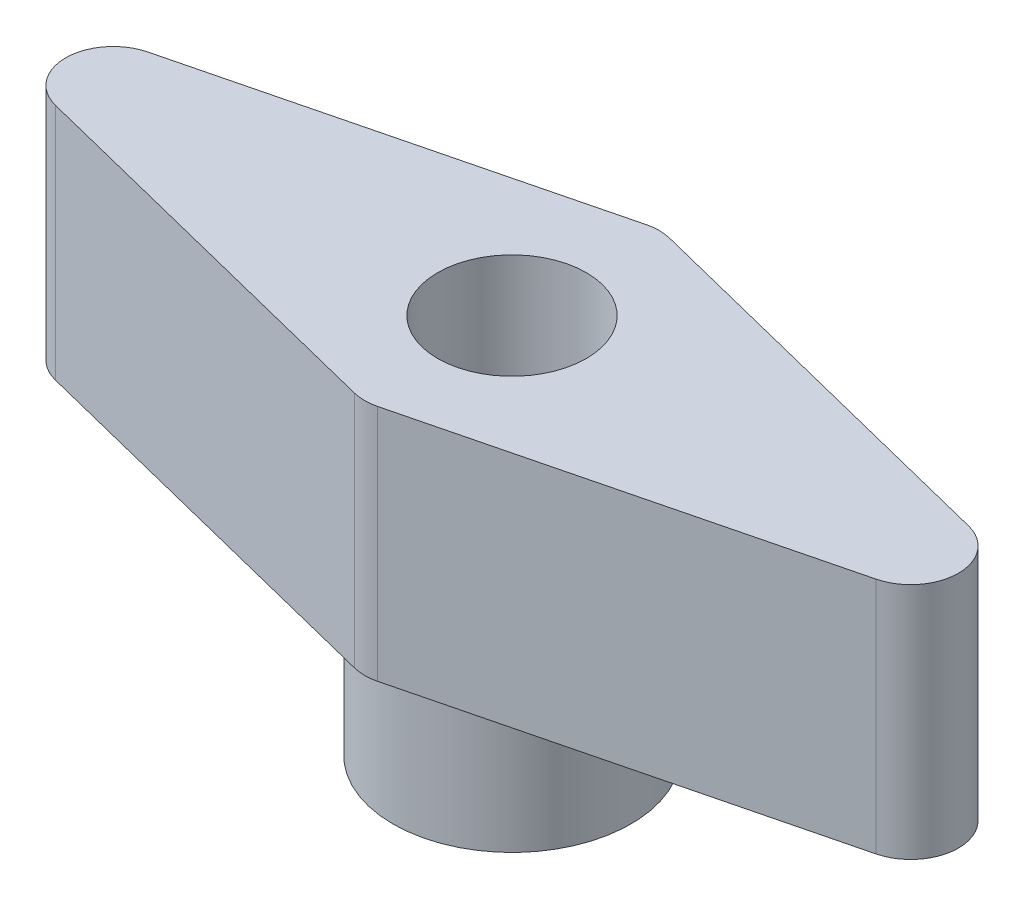
ISO-10303-21;
HEADER;
FILE_DESCRIPTION(('STEP AP214'),'2;1');
FILE_NAME('part.step','',(''),(''),'','','');
FILE_SCHEMA(('AUTOMOTIVE_DESIGN { 1 0 10303 214 1 1 1 1 }'));
ENDSEC;
DATA;
#1=APPLICATION_CONTEXT('core data for automotive mechanical design processes');
#2=APPLICATION_PROTOCOL_DEFINITION('international standard','automotive_design',2000,#1);
#3=PRODUCT_CONTEXT('',#1,'mechanical');
#4=PRODUCT('Part','Part','',(#3));
#5=PRODUCT_RELATED_PRODUCT_CATEGORY('part','',(#4));
#6=PRODUCT_DEFINITION_FORMATION('','',#4);
#7=PRODUCT_DEFINITION_CONTEXT('part definition',#1,'design');
#8=PRODUCT_DEFINITION('design','',#6,#7);
#9=PRODUCT_DEFINITION_SHAPE('','',#8);
#10=(LENGTH_UNIT() NAMED_UNIT(*) SI_UNIT(.MILLI.,.METRE.));
#11=(NAMED_UNIT(*) PLANE_ANGLE_UNIT() SI_UNIT($,.RADIAN.));
#12=(NAMED_UNIT(*) SI_UNIT($,.STERADIAN.) SOLID_ANGLE_UNIT());
#13=UNCERTAINTY_MEASURE_WITH_UNIT(LENGTH_MEASURE(1.E-05),#10,'distance_accuracy_value','');
#14=(GEOMETRIC_REPRESENTATION_CONTEXT(3) GLOBAL_UNCERTAINTY_ASSIGNED_CONTEXT((#13)) GLOBAL_UNIT_ASSIGNED_CONTEXT((#10,
#11,#12)) REPRESENTATION_CONTEXT('',''));
#15=CARTESIAN_POINT('',(0.,0.,0.));
#16=DIRECTION('',(0.,0.,1.));
#17=DIRECTION('',(1.,0.,0.));
#18=AXIS2_PLACEMENT_3D('',#15,#16,#17);
#19=CARTESIAN_POINT('',(21.2773117109311,-2.54,0.));
#20=DIRECTION('',(0.,1.,0.));
#21=DIRECTION('',(0.,0.,1.));
#22=AXIS2_PLACEMENT_3D('',#19,#20,#21);
#23=PLANE('',#22);
#24=DIRECTION('',(0.970142500145332,0.,-0.242535625036333));
#25=VECTOR('',#24,1.);
#26=CARTESIAN_POINT('',(21.2773117109311,-2.54,0.));
#27=LINE('',#26,#25);
#28=CARTESIAN_POINT('',(4.84135364991331,-2.54,4.10898951525446));
#29=VERTEX_POINT('',#28);
#30=CARTESIAN_POINT('',(19.3059821506358,-2.54,0.49283239007383));
#31=VERTEX_POINT('',#30);
#32=EDGE_CURVE('E167',#29,#31,#27,.T.);
#33=ORIENTED_EDGE('',*,*,#32,.F.);
#34=CARTESIAN_POINT('',(0.,-2.54,0.));
#35=DIRECTION('',(0.,1.,0.));
#36=DIRECTION('',(0.,0.,1.));
#37=AXIS2_PLACEMENT_3D('',#34,#35,#36);
#38=CIRCLE('',#37,6.35);
#39=CARTESIAN_POINT('',(4.84135364991331,-2.54,-4.10898951525446));
#40=VERTEX_POINT('',#39);
#41=EDGE_CURVE('E11',#29,#40,#38,.T.);
#42=ORIENTED_EDGE('',*,*,#41,.T.);
#43=DIRECTION('',(-0.970142500145332,0.,-0.242535625036333));
#44=VECTOR('',#43,1.);
#45=CARTESIAN_POINT('',(21.2773117109311,-2.54,0.));
#46=LINE('',#45,#44);
#47=CARTESIAN_POINT('',(19.3059821506358,-2.54,-0.492832390073826));
#48=VERTEX_POINT('',#47);
#49=EDGE_CURVE('E165',#48,#40,#46,.T.);
#50=ORIENTED_EDGE('',*,*,#49,.F.);
#51=CARTESIAN_POINT('',(19.1827740531174,-2.54,0.));
#52=DIRECTION('',(0.,1.,0.));
#53=DIRECTION('',(0.,0.,1.));
#54=AXIS2_PLACEMENT_3D('',#51,#52,#53);
#55=CIRCLE('',#54,0.508);
#56=EDGE_CURVE('E250',#48,#31,#55,.F.);
#57=ORIENTED_EDGE('',*,*,#56,.T.);
#58=EDGE_LOOP('',(#33,#42,#50,#57));
#59=FACE_BOUND('',#58,.T.);
#60=ADVANCED_FACE('F33',(#59),#23,.F.);
#61=CARTESIAN_POINT('',(21.2773117109311,-12.7,0.));
#62=DIRECTION('',(0.,1.,0.));
#63=DIRECTION('',(0.,0.,1.));
#64=AXIS2_PLACEMENT_3D('',#61,#62,#63);
#65=CYLINDRICAL_SURFACE('',#64,2.54);
#66=CARTESIAN_POINT('',(21.2773117109311,0.,0.));
#67=DIRECTION('',(0.,1.,0.));
#68=DIRECTION('',(0.,0.,1.));
#69=AXIS2_PLACEMENT_3D('',#66,#67,#68);
#70=CIRCLE('',#69,2.54);
#71=CARTESIAN_POINT('',(21.8933521985234,0.,2.46416195036915));
#72=VERTEX_POINT('',#71);
#73=CARTESIAN_POINT('',(21.8933521985234,0.,-2.46416195036914));
#74=VERTEX_POINT('',#73);
#75=EDGE_CURVE('E176',#72,#74,#70,.T.);
#76=ORIENTED_EDGE('',*,*,#75,.F.);
#77=DIRECTION('',(0.,1.,0.));
#78=VECTOR('',#77,1.);
#79=CARTESIAN_POINT('',(21.8933521985234,-12.7,2.46416195036915));
#80=LINE('',#79,#78);
#81=CARTESIAN_POINT('',(21.8933521985234,-12.7,2.46416195036915));
#82=VERTEX_POINT('',#81);
#83=EDGE_CURVE('E231',#82,#72,#80,.T.);
#84=ORIENTED_EDGE('',*,*,#83,.F.);
#85=CARTESIAN_POINT('',(21.2773117109311,-12.7,0.));
#86=DIRECTION('',(0.,1.,0.));
#87=DIRECTION('',(0.,0.,1.));
#88=AXIS2_PLACEMENT_3D('',#85,#86,#87);
#89=CIRCLE('',#88,2.54);
#90=CARTESIAN_POINT('',(21.8933521985234,-12.7,-2.46416195036914));
#91=VERTEX_POINT('',#90);
#92=EDGE_CURVE('E183',#82,#91,#89,.T.);
#93=ORIENTED_EDGE('',*,*,#92,.T.);
#94=DIRECTION('',(0.,1.,0.));
#95=VECTOR('',#94,1.);
#96=CARTESIAN_POINT('',(21.8933521985234,-12.7,-2.46416195036914));
#97=LINE('',#96,#95);
#98=EDGE_CURVE('E208',#91,#74,#97,.T.);
#99=ORIENTED_EDGE('',*,*,#98,.T.);
#100=EDGE_LOOP('',(#76,#84,#93,#99));
#101=FACE_BOUND('',#100,.T.);
#102=ADVANCED_FACE('F316',(#101),#65,.T.);
#103=CARTESIAN_POINT('',(0.616040487592289,-12.7,7.78348987810193));
#104=DIRECTION('',(0.242535625036333,0.,0.970142500145332));
#105=DIRECTION('',(0.970142500145332,0.,-0.242535625036333));
#106=AXIS2_PLACEMENT_3D('',#103,#104,#105);
#107=PLANE('',#106);
#108=DIRECTION('',(0.970142500145332,0.,-0.242535625036333));
#109=VECTOR('',#108,1.);
#110=CARTESIAN_POINT('',(0.616040487592289,0.,7.78348987810193));
#111=LINE('',#110,#109);
#112=CARTESIAN_POINT('',(0.616040487592289,0.,7.78348987810193));
#113=VERTEX_POINT('',#112);
#114=EDGE_CURVE('E187',#113,#72,#111,.T.);
#115=ORIENTED_EDGE('',*,*,#114,.F.);
#116=DIRECTION('',(0.,1.,0.));
#117=VECTOR('',#116,1.);
#118=CARTESIAN_POINT('',(0.616040487592289,-12.7,7.78348987810193));
#119=LINE('',#118,#117);
#120=CARTESIAN_POINT('',(0.616040487592289,-12.7,7.78348987810193));
#121=VERTEX_POINT('',#120);
#122=EDGE_CURVE('E234',#121,#113,#119,.T.);
#123=ORIENTED_EDGE('',*,*,#122,.F.);
#124=DIRECTION('',(0.970142500145332,0.,-0.242535625036333));
#125=VECTOR('',#124,1.);
#126=CARTESIAN_POINT('',(0.616040487592289,-12.7,7.78348987810193));
#127=LINE('',#126,#125);
#128=EDGE_CURVE('E205',#121,#82,#127,.T.);
#129=ORIENTED_EDGE('',*,*,#128,.T.);
#130=ORIENTED_EDGE('',*,*,#83,.T.);
#131=EDGE_LOOP('',(#115,#123,#129,#130));
#132=FACE_BOUND('',#131,.T.);
#133=ADVANCED_FACE('F321',(#132),#107,.T.);
#134=CARTESIAN_POINT('',(0.,-12.7,5.31932792773278));
#135=DIRECTION('',(0.,1.,0.));
#136=DIRECTION('',(0.,0.,1.));
#137=AXIS2_PLACEMENT_3D('',#134,#135,#136);
#138=CYLINDRICAL_SURFACE('',#137,2.54);
#139=CARTESIAN_POINT('',(0.,0.,5.31932792773278));
#140=DIRECTION('',(0.,1.,0.));
#141=DIRECTION('',(0.,0.,1.));
#142=AXIS2_PLACEMENT_3D('',#139,#140,#141);
#143=CIRCLE('',#142,2.54);
#144=CARTESIAN_POINT('',(-0.616040487592282,0.,7.78348987810193));
#145=VERTEX_POINT('',#144);
#146=EDGE_CURVE('E226',#145,#113,#143,.T.);
#147=ORIENTED_EDGE('',*,*,#146,.F.);
#148=DIRECTION('',(0.,1.,0.));
#149=VECTOR('',#148,1.);
#150=CARTESIAN_POINT('',(-0.616040487592282,-12.7,7.78348987810193));
#151=LINE('',#150,#149);
#152=CARTESIAN_POINT('',(-0.616040487592282,-12.7,7.78348987810193));
#153=VERTEX_POINT('',#152);
#154=EDGE_CURVE('E236',#153,#145,#151,.T.);
#155=ORIENTED_EDGE('',*,*,#154,.F.);
#156=CARTESIAN_POINT('',(0.,-12.7,5.31932792773278));
#157=DIRECTION('',(0.,1.,0.));
#158=DIRECTION('',(0.,0.,1.));
#159=AXIS2_PLACEMENT_3D('',#156,#157,#158);
#160=CIRCLE('',#159,2.54);
#161=EDGE_CURVE('E202',#153,#121,#160,.T.);
#162=ORIENTED_EDGE('',*,*,#161,.T.);
#163=ORIENTED_EDGE('',*,*,#122,.T.);
#164=EDGE_LOOP('',(#147,#155,#162,#163));
#165=FACE_BOUND('',#164,.T.);
#166=ADVANCED_FACE('F352',(#165),#138,.T.);
#167=CARTESIAN_POINT('',(-21.8933521985234,-12.7,2.46416195036914));
#168=DIRECTION('',(-0.242535625036333,0.,0.970142500145332));
#169=DIRECTION('',(0.970142500145332,0.,0.242535625036333));
#170=AXIS2_PLACEMENT_3D('',#167,#168,#169);
#171=PLANE('',#170);
#172=DIRECTION('',(0.970142500145332,0.,0.242535625036333));
#173=VECTOR('',#172,1.);
#174=CARTESIAN_POINT('',(-21.8933521985234,0.,2.46416195036914));
#175=LINE('',#174,#173);
#176=CARTESIAN_POINT('',(-21.8933521985234,0.,2.46416195036914));
#177=VERTEX_POINT('',#176);
#178=EDGE_CURVE('E223',#177,#145,#175,.T.);
#179=ORIENTED_EDGE('',*,*,#178,.F.);
#180=DIRECTION('',(0.,1.,0.));
#181=VECTOR('',#180,1.);
#182=CARTESIAN_POINT('',(-21.8933521985234,-12.7,2.46416195036914));
#183=LINE('',#182,#181);
#184=CARTESIAN_POINT('',(-21.8933521985234,-12.7,2.46416195036914));
#185=VERTEX_POINT('',#184);
#186=EDGE_CURVE('E238',#185,#177,#183,.T.);
#187=ORIENTED_EDGE('',*,*,#186,.F.);
#188=DIRECTION('',(0.970142500145332,0.,0.242535625036333));
#189=VECTOR('',#188,1.);
#190=CARTESIAN_POINT('',(-21.8933521985234,-12.7,2.46416195036914));
#191=LINE('',#190,#189);
#192=EDGE_CURVE('E199',#185,#153,#191,.T.);
#193=ORIENTED_EDGE('',*,*,#192,.T.);
#194=ORIENTED_EDGE('',*,*,#154,.T.);
#195=EDGE_LOOP('',(#179,#187,#193,#194));
#196=FACE_BOUND('',#195,.T.);
#197=ADVANCED_FACE('F356',(#196),#171,.T.);
#198=CARTESIAN_POINT('',(-21.2773117109311,-12.7,0.));
#199=DIRECTION('',(0.,1.,0.));
#200=DIRECTION('',(0.,0.,1.));
#201=AXIS2_PLACEMENT_3D('',#198,#199,#200);
#202=CYLINDRICAL_SURFACE('',#201,2.54);
#203=CARTESIAN_POINT('',(-21.2773117109311,0.,0.));
#204=DIRECTION('',(0.,1.,0.));
#205=DIRECTION('',(0.,0.,1.));
#206=AXIS2_PLACEMENT_3D('',#203,#204,#205);
#207=CIRCLE('',#206,2.54);
#208=CARTESIAN_POINT('',(-21.8933521985234,0.,-2.46416195036914));
#209=VERTEX_POINT('',#208);
#210=EDGE_CURVE('E220',#209,#177,#207,.T.);
#211=ORIENTED_EDGE('',*,*,#210,.F.);
#212=DIRECTION('',(0.,1.,0.));
#213=VECTOR('',#212,1.);
#214=CARTESIAN_POINT('',(-21.8933521985234,-12.7,-2.46416195036914));
#215=LINE('',#214,#213);
#216=CARTESIAN_POINT('',(-21.8933521985234,-12.7,-2.46416195036914));
#217=VERTEX_POINT('',#216);
#218=EDGE_CURVE('E240',#217,#209,#215,.T.);
#219=ORIENTED_EDGE('',*,*,#218,.F.);
#220=CARTESIAN_POINT('',(-21.2773117109311,-12.7,0.));
#221=DIRECTION('',(0.,1.,0.));
#222=DIRECTION('',(0.,0.,1.));
#223=AXIS2_PLACEMENT_3D('',#220,#221,#222);
#224=CIRCLE('',#223,2.54);
#225=EDGE_CURVE('E196',#217,#185,#224,.T.);
#226=ORIENTED_EDGE('',*,*,#225,.T.);
#227=ORIENTED_EDGE('',*,*,#186,.T.);
#228=EDGE_LOOP('',(#211,#219,#226,#227));
#229=FACE_BOUND('',#228,.T.);
#230=ADVANCED_FACE('F360',(#229),#202,.T.);
#231=CARTESIAN_POINT('',(-21.8933521985234,-12.7,-2.46416195036914));
#232=DIRECTION('',(-0.242535625036333,0.,-0.970142500145332));
#233=DIRECTION('',(-0.970142500145332,0.,0.242535625036333));
#234=AXIS2_PLACEMENT_3D('',#231,#232,#233);
#235=PLANE('',#234);
#236=DIRECTION('',(-0.970142500145332,0.,0.242535625036333));
#237=VECTOR('',#236,1.);
#238=CARTESIAN_POINT('',(-21.8933521985234,0.,-2.46416195036914));
#239=LINE('',#238,#237);
#240=CARTESIAN_POINT('',(-0.616040487592288,0.,-7.78348987810193));
#241=VERTEX_POINT('',#240);
#242=EDGE_CURVE('E217',#241,#209,#239,.T.);
#243=ORIENTED_EDGE('',*,*,#242,.F.);
#244=DIRECTION('',(0.,1.,0.));
#245=VECTOR('',#244,1.);
#246=CARTESIAN_POINT('',(-0.616040487592288,-12.7,-7.78348987810193));
#247=LINE('',#246,#245);
#248=CARTESIAN_POINT('',(-0.616040487592288,-12.7,-7.78348987810193));
#249=VERTEX_POINT('',#248);
#250=EDGE_CURVE('E242',#249,#241,#247,.T.);
#251=ORIENTED_EDGE('',*,*,#250,.F.);
#252=DIRECTION('',(-0.970142500145332,0.,0.242535625036333));
#253=VECTOR('',#252,1.);
#254=CARTESIAN_POINT('',(-21.8933521985234,-12.7,-2.46416195036914));
#255=LINE('',#254,#253);
#256=EDGE_CURVE('E193',#249,#217,#255,.T.);
#257=ORIENTED_EDGE('',*,*,#256,.T.);
#258=ORIENTED_EDGE('',*,*,#218,.T.);
#259=EDGE_LOOP('',(#243,#251,#257,#258));
#260=FACE_BOUND('',#259,.T.);
#261=ADVANCED_FACE('F364',(#260),#235,.T.);
#262=CARTESIAN_POINT('',(0.,-12.7,-5.31932792773278));
#263=DIRECTION('',(0.,1.,0.));
#264=DIRECTION('',(0.,0.,1.));
#265=AXIS2_PLACEMENT_3D('',#262,#263,#264);
#266=CYLINDRICAL_SURFACE('',#265,2.54);
#267=CARTESIAN_POINT('',(0.,0.,-5.31932792773278));
#268=DIRECTION('',(0.,1.,0.));
#269=DIRECTION('',(0.,0.,-1.));
#270=AXIS2_PLACEMENT_3D('',#267,#268,#269);
#271=CIRCLE('',#270,2.54);
#272=CARTESIAN_POINT('',(0.616040487592284,0.,-7.78348987810193));
#273=VERTEX_POINT('',#272);
#274=EDGE_CURVE('E214',#273,#241,#271,.T.);
#275=ORIENTED_EDGE('',*,*,#274,.F.);
#276=DIRECTION('',(0.,1.,0.));
#277=VECTOR('',#276,1.);
#278=CARTESIAN_POINT('',(0.616040487592284,-12.7,-7.78348987810193));
#279=LINE('',#278,#277);
#280=CARTESIAN_POINT('',(0.616040487592284,-12.7,-7.78348987810193));
#281=VERTEX_POINT('',#280);
#282=EDGE_CURVE('E244',#281,#273,#279,.T.);
#283=ORIENTED_EDGE('',*,*,#282,.F.);
#284=CARTESIAN_POINT('',(0.,-12.7,-5.31932792773278));
#285=DIRECTION('',(0.,1.,0.));
#286=DIRECTION('',(0.,0.,-1.));
#287=AXIS2_PLACEMENT_3D('',#284,#285,#286);
#288=CIRCLE('',#287,2.54);
#289=EDGE_CURVE('E190',#281,#249,#288,.T.);
#290=ORIENTED_EDGE('',*,*,#289,.T.);
#291=ORIENTED_EDGE('',*,*,#250,.T.);
#292=EDGE_LOOP('',(#275,#283,#290,#291));
#293=FACE_BOUND('',#292,.T.);
#294=ADVANCED_FACE('F368',(#293),#266,.T.);
#295=CARTESIAN_POINT('',(0.616040487592283,-12.7,-7.78348987810193));
#296=DIRECTION('',(0.242535625036333,0.,-0.970142500145332));
#297=DIRECTION('',(-0.970142500145332,0.,-0.242535625036333));
#298=AXIS2_PLACEMENT_3D('',#295,#296,#297);
#299=PLANE('',#298);
#300=DIRECTION('',(-0.970142500145332,0.,-0.242535625036333));
#301=VECTOR('',#300,1.);
#302=CARTESIAN_POINT('',(0.616040487592283,0.,-7.78348987810193));
#303=LINE('',#302,#301);
#304=EDGE_CURVE('E211',#74,#273,#303,.T.);
#305=ORIENTED_EDGE('',*,*,#304,.F.);
#306=ORIENTED_EDGE('',*,*,#98,.F.);
#307=DIRECTION('',(-0.970142500145332,0.,-0.242535625036333));
#308=VECTOR('',#307,1.);
#309=CARTESIAN_POINT('',(0.616040487592283,-12.7,-7.78348987810193));
#310=LINE('',#309,#308);
#311=EDGE_CURVE('E186',#91,#281,#310,.T.);
#312=ORIENTED_EDGE('',*,*,#311,.T.);
#313=ORIENTED_EDGE('',*,*,#282,.T.);
#314=EDGE_LOOP('',(#305,#306,#312,#313));
#315=FACE_BOUND('',#314,.T.);
#316=ADVANCED_FACE('F348',(#315),#299,.T.);
#317=CARTESIAN_POINT('',(21.2773117109311,-12.7,0.));
#318=DIRECTION('',(0.,1.,0.));
#319=DIRECTION('',(0.,0.,1.));
#320=AXIS2_PLACEMENT_3D('',#317,#318,#319);
#321=PLANE('',#320);
#322=DIRECTION('',(-0.970142500145332,0.,-0.242535625036333));
#323=VECTOR('',#322,1.);
#324=CARTESIAN_POINT('',(21.2773117109311,-12.7,0.));
#325=LINE('',#324,#323);
#326=CARTESIAN_POINT('',(19.3059821506358,-12.7,-0.492832390073826));
#327=VERTEX_POINT('',#326);
#328=CARTESIAN_POINT('',(4.84135364991331,-12.7,-4.10898951525446));
#329=VERTEX_POINT('',#328);
#330=EDGE_CURVE('E180',#327,#329,#325,.T.);
#331=ORIENTED_EDGE('',*,*,#330,.T.);
#332=CARTESIAN_POINT('',(0.,-12.7,0.));
#333=DIRECTION('',(0.,1.,0.));
#334=DIRECTION('',(0.,0.,1.));
#335=AXIS2_PLACEMENT_3D('',#332,#333,#334);
#336=CIRCLE('',#335,6.35);
#337=CARTESIAN_POINT('',(-4.84135364991331,-12.7,-4.10898951525446));
#338=VERTEX_POINT('',#337);
#339=EDGE_CURVE('E283',#329,#338,#336,.T.);
#340=ORIENTED_EDGE('',*,*,#339,.T.);
#341=DIRECTION('',(-0.970142500145332,0.,0.242535625036333));
#342=VECTOR('',#341,1.);
#343=CARTESIAN_POINT('',(18.7740985684686,-12.7,-10.0128525698499));
#344=LINE('',#343,#342);
#345=CARTESIAN_POINT('',(-19.3059821506358,-12.7,-0.492832390073826));
#346=VERTEX_POINT('',#345);
#347=EDGE_CURVE('E158',#338,#346,#344,.T.);
#348=ORIENTED_EDGE('',*,*,#347,.T.);
#349=CARTESIAN_POINT('',(-19.1827740531174,-12.7,0.));
#350=DIRECTION('',(0.,1.,0.));
#351=DIRECTION('',(0.,0.,1.));
#352=AXIS2_PLACEMENT_3D('',#349,#350,#351);
#353=CIRCLE('',#352,0.508);
#354=CARTESIAN_POINT('',(-19.3059821506358,-12.7,0.492832390073823));
#355=VERTEX_POINT('',#354);
#356=EDGE_CURVE('E56',#346,#355,#353,.T.);
#357=ORIENTED_EDGE('',*,*,#356,.T.);
#358=DIRECTION('',(0.970142500145332,0.,0.242535625036333));
#359=VECTOR('',#358,1.);
#360=CARTESIAN_POINT('',(18.7740985684687,-12.7,10.0128525698499));
#361=LINE('',#360,#359);
#362=CARTESIAN_POINT('',(-4.84135364991331,-12.7,4.10898951525446));
#363=VERTEX_POINT('',#362);
#364=EDGE_CURVE('E177',#355,#363,#361,.T.);
#365=ORIENTED_EDGE('',*,*,#364,.T.);
#366=CARTESIAN_POINT('',(4.84135364991331,-12.7,4.10898951525446));
#367=VERTEX_POINT('',#366);
#368=EDGE_CURVE('E286',#363,#367,#336,.T.);
#369=ORIENTED_EDGE('',*,*,#368,.T.);
#370=DIRECTION('',(0.970142500145332,0.,-0.242535625036333));
#371=VECTOR('',#370,1.);
#372=CARTESIAN_POINT('',(21.2773117109311,-12.7,0.));
#373=LINE('',#372,#371);
#374=CARTESIAN_POINT('',(19.3059821506358,-12.7,0.49283239007383));
#375=VERTEX_POINT('',#374);
#376=EDGE_CURVE('E174',#367,#375,#373,.T.);
#377=ORIENTED_EDGE('',*,*,#376,.T.);
#378=CARTESIAN_POINT('',(19.1827740531174,-12.7,0.));
#379=DIRECTION('',(0.,1.,0.));
#380=DIRECTION('',(0.,0.,1.));
#381=AXIS2_PLACEMENT_3D('',#378,#379,#380);
#382=CIRCLE('',#381,0.508);
#383=EDGE_CURVE('E261',#375,#327,#382,.T.);
#384=ORIENTED_EDGE('',*,*,#383,.T.);
#385=EDGE_LOOP('',(#331,#340,#348,#357,#365,#369,#377,#384));
#386=FACE_BOUND('',#385,.T.);
#387=ORIENTED_EDGE('',*,*,#92,.F.);
#388=ORIENTED_EDGE('',*,*,#128,.F.);
#389=ORIENTED_EDGE('',*,*,#161,.F.);
#390=ORIENTED_EDGE('',*,*,#192,.F.);
#391=ORIENTED_EDGE('',*,*,#225,.F.);
#392=ORIENTED_EDGE('',*,*,#256,.F.);
#393=ORIENTED_EDGE('',*,*,#289,.F.);
#394=ORIENTED_EDGE('',*,*,#311,.F.);
#395=EDGE_LOOP('',(#387,#388,#389,#390,#391,#392,#393,#394));
#396=FACE_BOUND('',#395,.T.);
#397=ADVANCED_FACE('F264',(#386,#396),#321,.F.);
#398=CARTESIAN_POINT('',(21.2773117109311,0.,0.));
#399=DIRECTION('',(0.,1.,0.));
#400=DIRECTION('',(0.,0.,1.));
#401=AXIS2_PLACEMENT_3D('',#398,#399,#400);
#402=PLANE('',#401);
#403=CARTESIAN_POINT('',(0.,0.,0.));
#404=DIRECTION('',(0.,-1.,0.));
#405=DIRECTION('',(0.,0.,-1.));
#406=AXIS2_PLACEMENT_3D('',#403,#404,#405);
#407=CIRCLE('',#406,3.96875);
#408=CARTESIAN_POINT('',(0.,0.,-3.96875));
#409=VERTEX_POINT('',#408);
#410=EDGE_CURVE('E294',#409,#409,#407,.T.);
#411=ORIENTED_EDGE('',*,*,#410,.T.);
#412=EDGE_LOOP('',(#411));
#413=FACE_BOUND('',#412,.T.);
#414=ORIENTED_EDGE('',*,*,#75,.T.);
#415=ORIENTED_EDGE('',*,*,#304,.T.);
#416=ORIENTED_EDGE('',*,*,#274,.T.);
#417=ORIENTED_EDGE('',*,*,#242,.T.);
#418=ORIENTED_EDGE('',*,*,#210,.T.);
#419=ORIENTED_EDGE('',*,*,#178,.T.);
#420=ORIENTED_EDGE('',*,*,#146,.T.);
#421=ORIENTED_EDGE('',*,*,#114,.T.);
#422=EDGE_LOOP('',(#414,#415,#416,#417,#418,#419,#420,#421));
#423=FACE_BOUND('',#422,.T.);
#424=ADVANCED_FACE('F298',(#413,#423),#402,.T.);
#425=CARTESIAN_POINT('',(0.,-12.7,5.31932792773278));
#426=DIRECTION('',(0.242535625036333,0.,0.970142500145332));
#427=DIRECTION('',(0.970142500145332,0.,-0.242535625036333));
#428=AXIS2_PLACEMENT_3D('',#425,#426,#427);
#429=PLANE('',#428);
#430=ORIENTED_EDGE('',*,*,#376,.F.);
#431=DIRECTION('',(0.,1.,0.));
#432=VECTOR('',#431,1.);
#433=CARTESIAN_POINT('',(4.84135364991331,-20.32,4.10898951525446));
#434=LINE('',#433,#432);
#435=EDGE_CURVE('E170',#367,#29,#434,.T.);
#436=ORIENTED_EDGE('',*,*,#435,.T.);
#437=ORIENTED_EDGE('',*,*,#32,.T.);
#438=DIRECTION('',(0.,1.,0.));
#439=VECTOR('',#438,1.);
#440=CARTESIAN_POINT('',(19.3059821506358,-12.7,0.49283239007383));
#441=LINE('',#440,#439);
#442=EDGE_CURVE('E253',#31,#375,#441,.F.);
#443=ORIENTED_EDGE('',*,*,#442,.T.);
#444=EDGE_LOOP('',(#430,#436,#437,#443));
#445=FACE_BOUND('',#444,.T.);
#446=ADVANCED_FACE('F281',(#445),#429,.F.);
#447=CARTESIAN_POINT('',(-21.2773117109311,-12.7,0.));
#448=DIRECTION('',(-0.242535625036333,0.,0.970142500145332));
#449=DIRECTION('',(0.970142500145332,0.,0.242535625036333));
#450=AXIS2_PLACEMENT_3D('',#447,#448,#449);
#451=PLANE('',#450);
#452=DIRECTION('',(0.970142500145332,0.,0.242535625036333));
#453=VECTOR('',#452,1.);
#454=CARTESIAN_POINT('',(18.7740985684687,-2.54,10.0128525698499));
#455=LINE('',#454,#453);
#456=CARTESIAN_POINT('',(-19.3059821506358,-2.54,0.492832390073823));
#457=VERTEX_POINT('',#456);
#458=CARTESIAN_POINT('',(-4.84135364991331,-2.54,4.10898951525446));
#459=VERTEX_POINT('',#458);
#460=EDGE_CURVE('E164',#457,#459,#455,.T.);
#461=ORIENTED_EDGE('',*,*,#460,.T.);
#462=DIRECTION('',(0.,1.,0.));
#463=VECTOR('',#462,1.);
#464=CARTESIAN_POINT('',(-4.84135364991331,-20.32,4.10898951525446));
#465=LINE('',#464,#463);
#466=EDGE_CURVE('E48',#459,#363,#465,.F.);
#467=ORIENTED_EDGE('',*,*,#466,.T.);
#468=ORIENTED_EDGE('',*,*,#364,.F.);
#469=DIRECTION('',(0.,1.,0.));
#470=VECTOR('',#469,1.);
#471=CARTESIAN_POINT('',(-19.3059821506358,-2.54,0.492832390073829));
#472=LINE('',#471,#470);
#473=EDGE_CURVE('E258',#355,#457,#472,.T.);
#474=ORIENTED_EDGE('',*,*,#473,.T.);
#475=EDGE_LOOP('',(#461,#467,#468,#474));
#476=FACE_BOUND('',#475,.T.);
#477=ADVANCED_FACE('F334',(#476),#451,.F.);
#478=CARTESIAN_POINT('',(-21.2773117109311,-12.7,0.));
#479=DIRECTION('',(-0.242535625036333,0.,-0.970142500145332));
#480=DIRECTION('',(-0.970142500145332,0.,0.242535625036333));
#481=AXIS2_PLACEMENT_3D('',#478,#479,#480);
#482=PLANE('',#481);
#483=ORIENTED_EDGE('',*,*,#347,.F.);
#484=DIRECTION('',(0.,1.,0.));
#485=VECTOR('',#484,1.);
#486=CARTESIAN_POINT('',(-4.84135364991331,-20.32,-4.10898951525446));
#487=LINE('',#486,#485);
#488=CARTESIAN_POINT('',(-4.84135364991331,-2.54,-4.10898951525446));
#489=VERTEX_POINT('',#488);
#490=EDGE_CURVE('E146',#338,#489,#487,.T.);
#491=ORIENTED_EDGE('',*,*,#490,.T.);
#492=DIRECTION('',(-0.970142500145332,0.,0.242535625036333));
#493=VECTOR('',#492,1.);
#494=CARTESIAN_POINT('',(18.7740985684686,-2.54,-10.0128525698499));
#495=LINE('',#494,#493);
#496=CARTESIAN_POINT('',(-19.3059821506358,-2.54,-0.492832390073826));
#497=VERTEX_POINT('',#496);
#498=EDGE_CURVE('E156',#489,#497,#495,.T.);
#499=ORIENTED_EDGE('',*,*,#498,.T.);
#500=DIRECTION('',(0.,1.,0.));
#501=VECTOR('',#500,1.);
#502=CARTESIAN_POINT('',(-19.3059821506358,-12.7,-0.492832390073829));
#503=LINE('',#502,#501);
#504=EDGE_CURVE('E256',#497,#346,#503,.F.);
#505=ORIENTED_EDGE('',*,*,#504,.T.);
#506=EDGE_LOOP('',(#483,#491,#499,#505));
#507=FACE_BOUND('',#506,.T.);
#508=ADVANCED_FACE('F154',(#507),#482,.F.);
#509=CARTESIAN_POINT('',(0.,-12.7,-5.31932792773278));
#510=DIRECTION('',(0.242535625036333,0.,-0.970142500145332));
#511=DIRECTION('',(-0.970142500145332,0.,-0.242535625036333));
#512=AXIS2_PLACEMENT_3D('',#509,#510,#511);
#513=PLANE('',#512);
#514=ORIENTED_EDGE('',*,*,#49,.T.);
#515=DIRECTION('',(0.,1.,0.));
#516=VECTOR('',#515,1.);
#517=CARTESIAN_POINT('',(4.84135364991331,-20.32,-4.10898951525446));
#518=LINE('',#517,#516);
#519=EDGE_CURVE('E275',#40,#329,#518,.F.);
#520=ORIENTED_EDGE('',*,*,#519,.T.);
#521=ORIENTED_EDGE('',*,*,#330,.F.);
#522=DIRECTION('',(0.,1.,0.));
#523=VECTOR('',#522,1.);
#524=CARTESIAN_POINT('',(19.3059821506358,-2.54,-0.492832390073825));
#525=LINE('',#524,#523);
#526=EDGE_CURVE('E233',#327,#48,#525,.T.);
#527=ORIENTED_EDGE('',*,*,#526,.T.);
#528=EDGE_LOOP('',(#514,#520,#521,#527));
#529=FACE_BOUND('',#528,.T.);
#530=ADVANCED_FACE('F273',(#529),#513,.F.);
#531=ORIENTED_EDGE('',*,*,#498,.F.);
#532=EDGE_CURVE('E37',#489,#459,#38,.T.);
#533=ORIENTED_EDGE('',*,*,#532,.T.);
#534=ORIENTED_EDGE('',*,*,#460,.F.);
#535=CARTESIAN_POINT('',(-19.1827740531174,-2.54,0.));
#536=DIRECTION('',(0.,1.,0.));
#537=DIRECTION('',(0.,0.,1.));
#538=AXIS2_PLACEMENT_3D('',#535,#536,#537);
#539=CIRCLE('',#538,0.508);
#540=EDGE_CURVE('E162',#457,#497,#539,.F.);
#541=ORIENTED_EDGE('',*,*,#540,.T.);
#542=EDGE_LOOP('',(#531,#533,#534,#541));
#543=FACE_BOUND('',#542,.T.);
#544=ADVANCED_FACE('F161',(#543),#23,.F.);
#545=CARTESIAN_POINT('',(19.1827740531174,-12.7,0.));
#546=DIRECTION('',(0.,-1.,0.));
#547=DIRECTION('',(0.,0.,-1.));
#548=AXIS2_PLACEMENT_3D('',#545,#546,#547);
#549=CYLINDRICAL_SURFACE('',#548,0.508);
#550=ORIENTED_EDGE('',*,*,#383,.F.);
#551=ORIENTED_EDGE('',*,*,#442,.F.);
#552=ORIENTED_EDGE('',*,*,#56,.F.);
#553=ORIENTED_EDGE('',*,*,#526,.F.);
#554=EDGE_LOOP('',(#550,#551,#552,#553));
#555=FACE_BOUND('',#554,.T.);
#556=ADVANCED_FACE('F276',(#555),#549,.F.);
#557=CARTESIAN_POINT('',(-19.1827740531174,-12.7,0.));
#558=DIRECTION('',(0.,-1.,0.));
#559=DIRECTION('',(0.,0.,-1.));
#560=AXIS2_PLACEMENT_3D('',#557,#558,#559);
#561=CYLINDRICAL_SURFACE('',#560,0.508);
#562=ORIENTED_EDGE('',*,*,#356,.F.);
#563=ORIENTED_EDGE('',*,*,#504,.F.);
#564=ORIENTED_EDGE('',*,*,#540,.F.);
#565=ORIENTED_EDGE('',*,*,#473,.F.);
#566=EDGE_LOOP('',(#562,#563,#564,#565));
#567=FACE_BOUND('',#566,.T.);
#568=ADVANCED_FACE('F35',(#567),#561,.F.);
#569=CARTESIAN_POINT('',(0.,-20.32,0.));
#570=DIRECTION('',(0.,1.,0.));
#571=DIRECTION('',(0.,0.,1.));
#572=AXIS2_PLACEMENT_3D('',#569,#570,#571);
#573=CYLINDRICAL_SURFACE('',#572,6.35);
#574=CARTESIAN_POINT('',(0.,-20.32,0.));
#575=DIRECTION('',(0.,1.,0.));
#576=DIRECTION('',(0.,0.,1.));
#577=AXIS2_PLACEMENT_3D('',#574,#575,#576);
#578=CIRCLE('',#577,6.35);
#579=CARTESIAN_POINT('',(0.,-20.32,6.35));
#580=VERTEX_POINT('',#579);
#581=EDGE_CURVE('E159',#580,#580,#578,.T.);
#582=ORIENTED_EDGE('',*,*,#581,.T.);
#583=EDGE_LOOP('',(#582));
#584=FACE_BOUND('',#583,.T.);
#585=ORIENTED_EDGE('',*,*,#41,.F.);
#586=ORIENTED_EDGE('',*,*,#435,.F.);
#587=ORIENTED_EDGE('',*,*,#368,.F.);
#588=ORIENTED_EDGE('',*,*,#466,.F.);
#589=ORIENTED_EDGE('',*,*,#532,.F.);
#590=ORIENTED_EDGE('',*,*,#490,.F.);
#591=ORIENTED_EDGE('',*,*,#339,.F.);
#592=ORIENTED_EDGE('',*,*,#519,.F.);
#593=EDGE_LOOP('',(#585,#586,#587,#588,#589,#590,#591,#592));
#594=FACE_BOUND('',#593,.T.);
#595=ADVANCED_FACE('F145',(#584,#594),#573,.T.);
#596=CARTESIAN_POINT('',(0.,-20.32,0.));
#597=DIRECTION('',(0.,1.,0.));
#598=DIRECTION('',(0.,0.,1.));
#599=AXIS2_PLACEMENT_3D('',#596,#597,#598);
#600=CYLINDRICAL_SURFACE('',#599,3.96875);
#601=CARTESIAN_POINT('',(0.,-20.32,0.));
#602=DIRECTION('',(0.,1.,0.));
#603=DIRECTION('',(0.,0.,1.));
#604=AXIS2_PLACEMENT_3D('',#601,#602,#603);
#605=CIRCLE('',#604,3.96875);
#606=CARTESIAN_POINT('',(0.,-20.32,3.96875));
#607=VERTEX_POINT('',#606);
#608=EDGE_CURVE('E291',#607,#607,#605,.T.);
#609=ORIENTED_EDGE('',*,*,#608,.F.);
#610=EDGE_LOOP('',(#609));
#611=FACE_BOUND('',#610,.T.);
#612=ORIENTED_EDGE('',*,*,#410,.F.);
#613=EDGE_LOOP('',(#612));
#614=FACE_BOUND('',#613,.T.);
#615=ADVANCED_FACE('F301',(#611,#614),#600,.F.);
#616=CARTESIAN_POINT('',(0.,-20.32,0.));
#617=DIRECTION('',(0.,1.,0.));
#618=DIRECTION('',(0.,0.,1.));
#619=AXIS2_PLACEMENT_3D('',#616,#617,#618);
#620=PLANE('',#619);
#621=ORIENTED_EDGE('',*,*,#608,.T.);
#622=EDGE_LOOP('',(#621));
#623=FACE_BOUND('',#622,.T.);
#624=ORIENTED_EDGE('',*,*,#581,.F.);
#625=EDGE_LOOP('',(#624));
#626=FACE_BOUND('',#625,.T.);
#627=ADVANCED_FACE('F303',(#623,#626),#620,.F.);
#628=CLOSED_SHELL('',(#60,#102,#133,#166,#197,#230,#261,#294,#316,#397,#424,#446,#477,#508,#530,
#544,#556,#568,#595,#615,#627));
#629=MANIFOLD_SOLID_BREP('B2',#628);
#630=ADVANCED_BREP_SHAPE_REPRESENTATION('',(#18,#629),#14);
#631=SHAPE_DEFINITION_REPRESENTATION(#9,#630);
ENDSEC;
END-ISO-10303-21;
